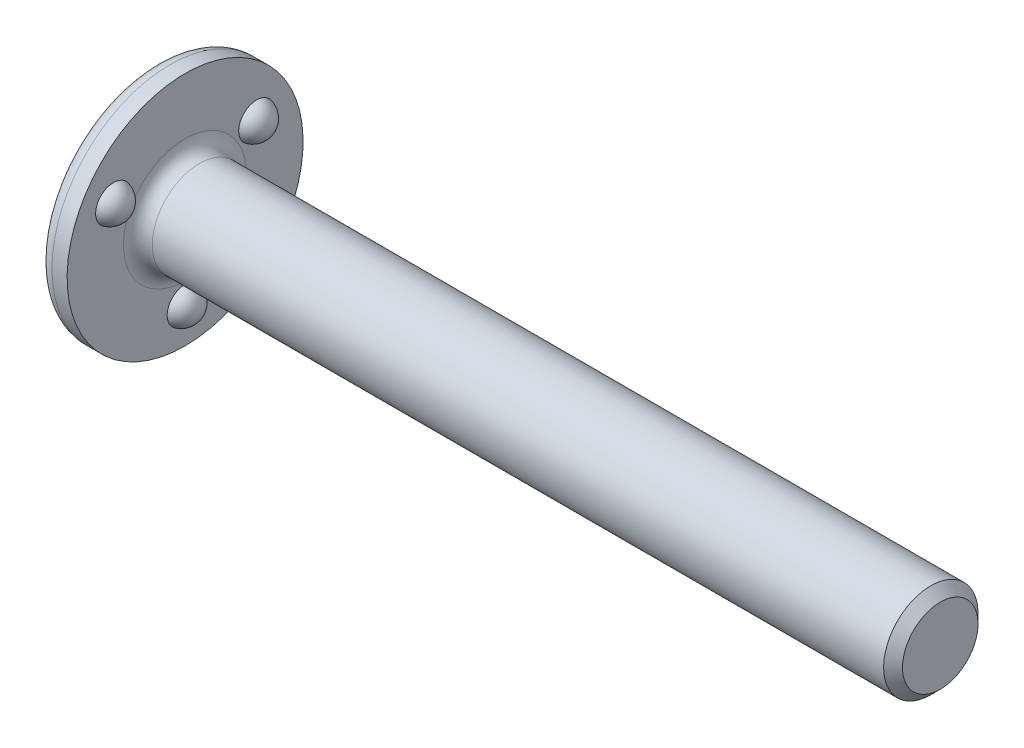
ISO-10303-21;
HEADER;
FILE_DESCRIPTION(('STEP AP214'),'2;1');
FILE_NAME('part.step','',(''),(''),'','','');
FILE_SCHEMA(('AUTOMOTIVE_DESIGN { 1 0 10303 214 1 1 1 1 }'));
ENDSEC;
DATA;
#1=APPLICATION_CONTEXT('core data for automotive mechanical design processes');
#2=APPLICATION_PROTOCOL_DEFINITION('international standard','automotive_design',2000,#1);
#3=PRODUCT_CONTEXT('',#1,'mechanical');
#4=PRODUCT('Part','Part','',(#3));
#5=PRODUCT_RELATED_PRODUCT_CATEGORY('part','',(#4));
#6=PRODUCT_DEFINITION_FORMATION('','',#4);
#7=PRODUCT_DEFINITION_CONTEXT('part definition',#1,'design');
#8=PRODUCT_DEFINITION('design','',#6,#7);
#9=PRODUCT_DEFINITION_SHAPE('','',#8);
#10=(LENGTH_UNIT() NAMED_UNIT(*) SI_UNIT(.MILLI.,.METRE.));
#11=(NAMED_UNIT(*) PLANE_ANGLE_UNIT() SI_UNIT($,.RADIAN.));
#12=(NAMED_UNIT(*) SI_UNIT($,.STERADIAN.) SOLID_ANGLE_UNIT());
#13=UNCERTAINTY_MEASURE_WITH_UNIT(LENGTH_MEASURE(1.E-05),#10,'distance_accuracy_value','');
#14=(GEOMETRIC_REPRESENTATION_CONTEXT(3) GLOBAL_UNCERTAINTY_ASSIGNED_CONTEXT((#13)) GLOBAL_UNIT_ASSIGNED_CONTEXT((#10,
#11,#12)) REPRESENTATION_CONTEXT('',''));
#15=CARTESIAN_POINT('',(0.,0.,0.));
#16=DIRECTION('',(0.,0.,1.));
#17=DIRECTION('',(1.,0.,0.));
#18=AXIS2_PLACEMENT_3D('',#15,#16,#17);
#19=CARTESIAN_POINT('',(0.,0.,0.));
#20=DIRECTION('',(1.,0.,0.));
#21=DIRECTION('',(0.,1.,0.));
#22=AXIS2_PLACEMENT_3D('',#19,#20,#21);
#23=PLANE('',#22);
#24=CARTESIAN_POINT('',(0.,0.,0.));
#25=DIRECTION('',(1.,0.,0.));
#26=DIRECTION('',(0.,1.,0.));
#27=AXIS2_PLACEMENT_3D('',#24,#25,#26);
#28=CIRCLE('',#27,6.9723);
#29=CARTESIAN_POINT('',(0.,6.9723,0.));
#30=VERTEX_POINT('',#29);
#31=EDGE_CURVE('E45',#30,#30,#28,.F.);
#32=ORIENTED_EDGE('',*,*,#31,.T.);
#33=EDGE_LOOP('',(#32));
#34=FACE_BOUND('',#33,.T.);
#35=ADVANCED_FACE('F30',(#34),#23,.F.);
#36=CARTESIAN_POINT('',(0.,0.,0.));
#37=DIRECTION('',(-1.,0.,0.));
#38=DIRECTION('',(0.,-1.,0.));
#39=AXIS2_PLACEMENT_3D('',#36,#37,#38);
#40=CYLINDRICAL_SURFACE('',#39,7.9375);
#41=CARTESIAN_POINT('',(0.9652,0.,0.));
#42=DIRECTION('',(1.,0.,0.));
#43=DIRECTION('',(0.,1.,0.));
#44=AXIS2_PLACEMENT_3D('',#41,#42,#43);
#45=CIRCLE('',#44,7.9375);
#46=CARTESIAN_POINT('',(0.9652,7.9375,0.));
#47=VERTEX_POINT('',#46);
#48=EDGE_CURVE('E41',#47,#47,#45,.T.);
#49=ORIENTED_EDGE('',*,*,#48,.T.);
#50=EDGE_LOOP('',(#49));
#51=FACE_BOUND('',#50,.T.);
#52=CARTESIAN_POINT('',(1.984375,0.,0.));
#53=DIRECTION('',(-1.,0.,0.));
#54=DIRECTION('',(0.,-1.,0.));
#55=AXIS2_PLACEMENT_3D('',#52,#53,#54);
#56=CIRCLE('',#55,7.9375);
#57=CARTESIAN_POINT('',(1.984375,-7.9375,0.));
#58=VERTEX_POINT('',#57);
#59=EDGE_CURVE('E56',#58,#58,#56,.T.);
#60=ORIENTED_EDGE('',*,*,#59,.T.);
#61=EDGE_LOOP('',(#60));
#62=FACE_BOUND('',#61,.T.);
#63=ADVANCED_FACE('F75',(#51,#62),#40,.T.);
#64=CARTESIAN_POINT('',(1.984375,7.9375,0.));
#65=DIRECTION('',(-1.,0.,0.));
#66=DIRECTION('',(0.,-1.,0.));
#67=AXIS2_PLACEMENT_3D('',#64,#65,#66);
#68=PLANE('',#67);
#69=CARTESIAN_POINT('',(1.984375,0.,0.));
#70=DIRECTION('',(-1.,0.,0.));
#71=DIRECTION('',(0.,-1.,0.));
#72=AXIS2_PLACEMENT_3D('',#69,#70,#71);
#73=CIRCLE('',#72,4.1402);
#74=CARTESIAN_POINT('',(1.984375,-4.1402,0.));
#75=VERTEX_POINT('',#74);
#76=EDGE_CURVE('E37',#75,#75,#73,.T.);
#77=ORIENTED_EDGE('',*,*,#76,.T.);
#78=EDGE_LOOP('',(#77));
#79=FACE_BOUND('',#78,.T.);
#80=CARTESIAN_POINT('',(1.984375,2.77812499999996,-4.81185364977731));
#81=DIRECTION('',(1.,0.,0.));
#82=DIRECTION('',(0.,0.866025403784443,0.499999999999992));
#83=AXIS2_PLACEMENT_3D('',#80,#81,#82);
#84=CIRCLE('',#83,1.2065);
#85=CARTESIAN_POINT('',(1.984375,3.82298464966589,-4.20860364977732));
#86=VERTEX_POINT('',#85);
#87=EDGE_CURVE('E65',#86,#86,#84,.T.);
#88=ORIENTED_EDGE('',*,*,#87,.F.);
#89=EDGE_LOOP('',(#88));
#90=FACE_BOUND('',#89,.T.);
#91=CARTESIAN_POINT('',(1.984375,2.77812500000002,4.81185364977728));
#92=DIRECTION('',(1.,0.,0.));
#93=DIRECTION('',(0.,-0.866025403784436,0.500000000000004));
#94=AXIS2_PLACEMENT_3D('',#91,#92,#93);
#95=CIRCLE('',#94,1.2065);
#96=CARTESIAN_POINT('',(1.984375,1.7332653503341,5.41510364977728));
#97=VERTEX_POINT('',#96);
#98=EDGE_CURVE('E62',#97,#97,#95,.T.);
#99=ORIENTED_EDGE('',*,*,#98,.F.);
#100=EDGE_LOOP('',(#99));
#101=FACE_BOUND('',#100,.T.);
#102=CARTESIAN_POINT('',(1.984375,-5.55625,0.));
#103=DIRECTION('',(1.,0.,0.));
#104=DIRECTION('',(0.,0.,-1.));
#105=AXIS2_PLACEMENT_3D('',#102,#103,#104);
#106=CIRCLE('',#105,1.2065);
#107=CARTESIAN_POINT('',(1.984375,-5.55625,-1.2065));
#108=VERTEX_POINT('',#107);
#109=EDGE_CURVE('E59',#108,#108,#106,.T.);
#110=ORIENTED_EDGE('',*,*,#109,.F.);
#111=EDGE_LOOP('',(#110));
#112=FACE_BOUND('',#111,.T.);
#113=ORIENTED_EDGE('',*,*,#59,.F.);
#114=EDGE_LOOP('',(#113));
#115=FACE_BOUND('',#114,.T.);
#116=ADVANCED_FACE('F71',(#79,#90,#101,#112,#115),#68,.F.);
#117=CARTESIAN_POINT('',(0.,0.,0.));
#118=DIRECTION('',(-1.,0.,0.));
#119=DIRECTION('',(0.,-1.,0.));
#120=AXIS2_PLACEMENT_3D('',#117,#118,#119);
#121=CYLINDRICAL_SURFACE('',#120,3.175);
#122=CARTESIAN_POINT('',(2.949575,0.,0.));
#123=DIRECTION('',(-1.,0.,0.));
#124=DIRECTION('',(0.,-1.,0.));
#125=AXIS2_PLACEMENT_3D('',#122,#123,#124);
#126=CIRCLE('',#125,3.175);
#127=CARTESIAN_POINT('',(2.949575,-3.175,0.));
#128=VERTEX_POINT('',#127);
#129=EDGE_CURVE('E10',#128,#128,#126,.F.);
#130=ORIENTED_EDGE('',*,*,#129,.T.);
#131=EDGE_LOOP('',(#130));
#132=FACE_BOUND('',#131,.T.);
#133=CARTESIAN_POINT('',(52.149375,0.,0.));
#134=DIRECTION('',(-1.,0.,0.));
#135=DIRECTION('',(0.,-1.,0.));
#136=AXIS2_PLACEMENT_3D('',#133,#134,#135);
#137=CIRCLE('',#136,3.175);
#138=CARTESIAN_POINT('',(52.149375,-3.175,0.));
#139=VERTEX_POINT('',#138);
#140=EDGE_CURVE('E53',#139,#139,#137,.T.);
#141=ORIENTED_EDGE('',*,*,#140,.T.);
#142=EDGE_LOOP('',(#141));
#143=FACE_BOUND('',#142,.T.);
#144=ADVANCED_FACE('F74',(#132,#143),#121,.T.);
#145=CARTESIAN_POINT('',(52.784375,3.175,0.));
#146=DIRECTION('',(-1.,0.,0.));
#147=DIRECTION('',(0.,-1.,0.));
#148=AXIS2_PLACEMENT_3D('',#145,#146,#147);
#149=PLANE('',#148);
#150=CARTESIAN_POINT('',(52.784375,0.,0.));
#151=DIRECTION('',(-1.,0.,0.));
#152=DIRECTION('',(0.,-1.,0.));
#153=AXIS2_PLACEMENT_3D('',#150,#151,#152);
#154=CIRCLE('',#153,2.53999999999999);
#155=CARTESIAN_POINT('',(52.784375,-2.53999999999999,0.));
#156=VERTEX_POINT('',#155);
#157=EDGE_CURVE('E50',#156,#156,#154,.F.);
#158=ORIENTED_EDGE('',*,*,#157,.T.);
#159=EDGE_LOOP('',(#158));
#160=FACE_BOUND('',#159,.T.);
#161=ADVANCED_FACE('F96',(#160),#149,.F.);
#162=CARTESIAN_POINT('',(52.149375,0.,0.));
#163=DIRECTION('',(-1.,0.,0.));
#164=DIRECTION('',(0.,-1.,0.));
#165=AXIS2_PLACEMENT_3D('',#162,#163,#164);
#166=CONICAL_SURFACE('',#165,3.175,0.785398163397445);
#167=ORIENTED_EDGE('',*,*,#157,.F.);
#168=EDGE_LOOP('',(#167));
#169=FACE_BOUND('',#168,.T.);
#170=ORIENTED_EDGE('',*,*,#140,.F.);
#171=EDGE_LOOP('',(#170));
#172=FACE_BOUND('',#171,.T.);
#173=ADVANCED_FACE('F93',(#169,#172),#166,.T.);
#174=CARTESIAN_POINT('',(1.7129125,-5.55625,0.));
#175=DIRECTION('',(1.,0.,0.));
#176=DIRECTION('',(0.,-1.,0.));
#177=AXIS2_PLACEMENT_3D('',#174,#175,#176);
#178=SPHERICAL_SURFACE('',#177,1.2366625);
#179=ORIENTED_EDGE('',*,*,#109,.T.);
#180=EDGE_LOOP('',(#179));
#181=FACE_BOUND('',#180,.T.);
#182=ADVANCED_FACE('F95',(#181),#178,.T.);
#183=CARTESIAN_POINT('',(1.7129125,2.77812500000002,4.81185364977728));
#184=DIRECTION('',(1.,0.,0.));
#185=DIRECTION('',(0.,0.500000000000004,0.866025403784436));
#186=AXIS2_PLACEMENT_3D('',#183,#184,#185);
#187=SPHERICAL_SURFACE('',#186,1.2366625);
#188=ORIENTED_EDGE('',*,*,#98,.T.);
#189=EDGE_LOOP('',(#188));
#190=FACE_BOUND('',#189,.T.);
#191=ADVANCED_FACE('F106',(#190),#187,.T.);
#192=CARTESIAN_POINT('',(1.7129125,2.77812499999996,-4.81185364977731));
#193=DIRECTION('',(1.,0.,0.));
#194=DIRECTION('',(0.,0.499999999999992,-0.866025403784443));
#195=AXIS2_PLACEMENT_3D('',#192,#193,#194);
#196=SPHERICAL_SURFACE('',#195,1.2366625);
#197=ORIENTED_EDGE('',*,*,#87,.T.);
#198=EDGE_LOOP('',(#197));
#199=FACE_BOUND('',#198,.T.);
#200=ADVANCED_FACE('F69',(#199),#196,.T.);
#201=CARTESIAN_POINT('',(0.9652,0.,0.));
#202=DIRECTION('',(1.,0.,0.));
#203=DIRECTION('',(0.,1.,0.));
#204=AXIS2_PLACEMENT_3D('',#201,#202,#203);
#205=TOROIDAL_SURFACE('',#204,6.9723,0.9652);
#206=ORIENTED_EDGE('',*,*,#48,.F.);
#207=EDGE_LOOP('',(#206));
#208=FACE_BOUND('',#207,.T.);
#209=ORIENTED_EDGE('',*,*,#31,.F.);
#210=EDGE_LOOP('',(#209));
#211=FACE_BOUND('',#210,.T.);
#212=ADVANCED_FACE('F98',(#208,#211),#205,.T.);
#213=CARTESIAN_POINT('',(2.949575,0.,0.));
#214=DIRECTION('',(-1.,0.,0.));
#215=DIRECTION('',(0.,-1.,0.));
#216=AXIS2_PLACEMENT_3D('',#213,#214,#215);
#217=TOROIDAL_SURFACE('',#216,4.1402,0.9652);
#218=ORIENTED_EDGE('',*,*,#129,.F.);
#219=EDGE_LOOP('',(#218));
#220=FACE_BOUND('',#219,.T.);
#221=ORIENTED_EDGE('',*,*,#76,.F.);
#222=EDGE_LOOP('',(#221));
#223=FACE_BOUND('',#222,.T.);
#224=ADVANCED_FACE('F32',(#220,#223),#217,.F.);
#225=CLOSED_SHELL('',(#35,#63,#116,#144,#161,#173,#182,#191,#200,#212,#224));
#226=MANIFOLD_SOLID_BREP('B2',#225);
#227=ADVANCED_BREP_SHAPE_REPRESENTATION('',(#18,#226),#14);
#228=SHAPE_DEFINITION_REPRESENTATION(#9,#227);
ENDSEC;
END-ISO-10303-21;
